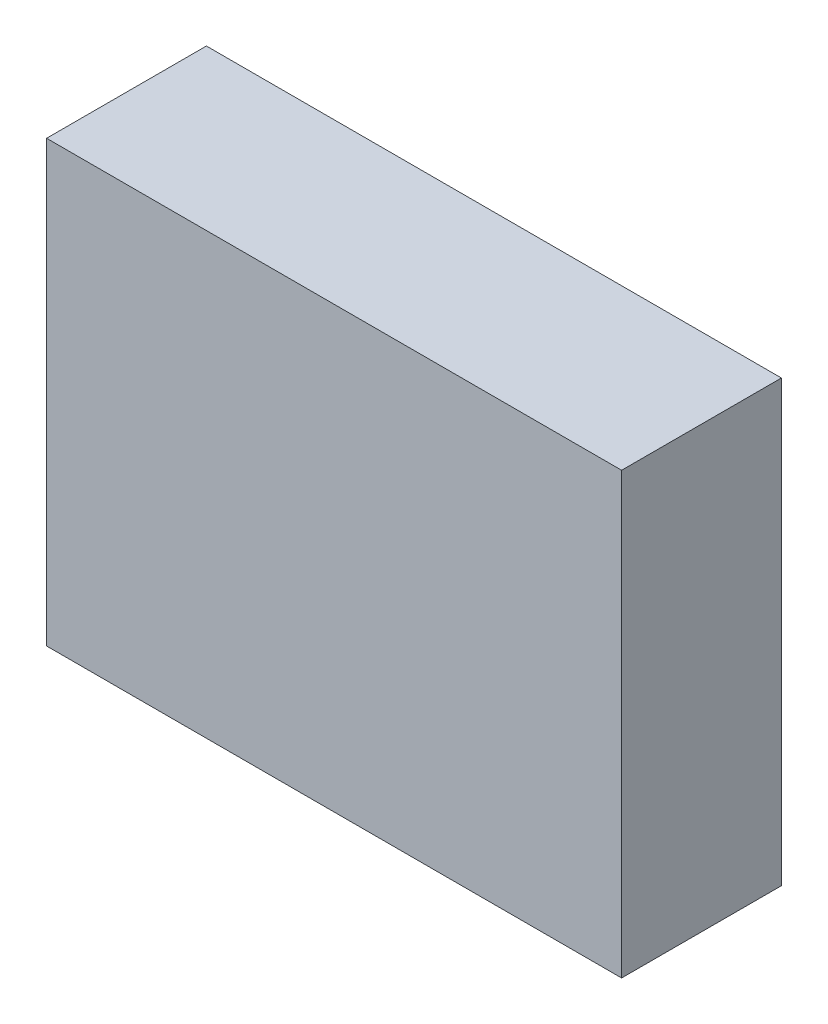
ISO-10303-21;
HEADER;
FILE_DESCRIPTION(('STEP AP214'),'2;1');
FILE_NAME('part.step','',(''),(''),'','','');
FILE_SCHEMA(('AUTOMOTIVE_DESIGN { 1 0 10303 214 1 1 1 1 }'));
ENDSEC;
DATA;
#1=APPLICATION_CONTEXT('core data for automotive mechanical design processes');
#2=APPLICATION_PROTOCOL_DEFINITION('international standard','automotive_design',2000,#1);
#3=PRODUCT_CONTEXT('',#1,'mechanical');
#4=PRODUCT('Part','Part','',(#3));
#5=PRODUCT_RELATED_PRODUCT_CATEGORY('part','',(#4));
#6=PRODUCT_DEFINITION_FORMATION('','',#4);
#7=PRODUCT_DEFINITION_CONTEXT('part definition',#1,'design');
#8=PRODUCT_DEFINITION('design','',#6,#7);
#9=PRODUCT_DEFINITION_SHAPE('','',#8);
#10=(LENGTH_UNIT() NAMED_UNIT(*) SI_UNIT(.MILLI.,.METRE.));
#11=(NAMED_UNIT(*) PLANE_ANGLE_UNIT() SI_UNIT($,.RADIAN.));
#12=(NAMED_UNIT(*) SI_UNIT($,.STERADIAN.) SOLID_ANGLE_UNIT());
#13=UNCERTAINTY_MEASURE_WITH_UNIT(LENGTH_MEASURE(1.E-05),#10,'distance_accuracy_value','');
#14=(GEOMETRIC_REPRESENTATION_CONTEXT(3) GLOBAL_UNCERTAINTY_ASSIGNED_CONTEXT((#13)) GLOBAL_UNIT_ASSIGNED_CONTEXT((#10,
#11,#12)) REPRESENTATION_CONTEXT('',''));
#15=CARTESIAN_POINT('',(0.,0.,0.));
#16=DIRECTION('',(0.,0.,1.));
#17=DIRECTION('',(1.,0.,0.));
#18=AXIS2_PLACEMENT_3D('',#15,#16,#17);
#19=CARTESIAN_POINT('',(-1.0795,0.8255,0.5999988));
#20=DIRECTION('',(0.,0.,1.));
#21=DIRECTION('',(1.,0.,0.));
#22=AXIS2_PLACEMENT_3D('',#19,#20,#21);
#23=PLANE('',#22);
#24=DIRECTION('',(0.,1.,0.));
#25=VECTOR('',#24,1.);
#26=CARTESIAN_POINT('',(1.0795,0.8255,0.5999988));
#27=LINE('',#26,#25);
#28=CARTESIAN_POINT('',(1.0795,0.8255,0.5999988));
#29=VERTEX_POINT('',#28);
#30=CARTESIAN_POINT('',(1.0795,-0.8255,0.5999988));
#31=VERTEX_POINT('',#30);
#32=EDGE_CURVE('E53',#29,#31,#27,.F.);
#33=ORIENTED_EDGE('',*,*,#32,.F.);
#34=DIRECTION('',(1.,0.,0.));
#35=VECTOR('',#34,1.);
#36=CARTESIAN_POINT('',(-1.0795,0.8255,0.5999988));
#37=LINE('',#36,#35);
#38=CARTESIAN_POINT('',(-1.0795,0.8255,0.5999988));
#39=VERTEX_POINT('',#38);
#40=EDGE_CURVE('E68',#39,#29,#37,.T.);
#41=ORIENTED_EDGE('',*,*,#40,.F.);
#42=DIRECTION('',(0.,1.,0.));
#43=VECTOR('',#42,1.);
#44=CARTESIAN_POINT('',(-1.0795,-0.8255,0.5999988));
#45=LINE('',#44,#43);
#46=CARTESIAN_POINT('',(-1.0795,-0.8255,0.5999988));
#47=VERTEX_POINT('',#46);
#48=EDGE_CURVE('E20',#47,#39,#45,.T.);
#49=ORIENTED_EDGE('',*,*,#48,.F.);
#50=DIRECTION('',(1.,0.,0.));
#51=VECTOR('',#50,1.);
#52=CARTESIAN_POINT('',(1.0795,-0.8255,0.5999988));
#53=LINE('',#52,#51);
#54=EDGE_CURVE('E58',#31,#47,#53,.F.);
#55=ORIENTED_EDGE('',*,*,#54,.F.);
#56=EDGE_LOOP('',(#33,#41,#49,#55));
#57=FACE_BOUND('',#56,.T.);
#58=ADVANCED_FACE('F17',(#57),#23,.T.);
#59=CARTESIAN_POINT('',(-1.0795,-0.8255,0.));
#60=DIRECTION('',(-1.,0.,0.));
#61=DIRECTION('',(0.,0.,1.));
#62=AXIS2_PLACEMENT_3D('',#59,#60,#61);
#63=PLANE('',#62);
#64=DIRECTION('',(0.,0.,1.));
#65=VECTOR('',#64,1.);
#66=CARTESIAN_POINT('',(-1.0795,0.8255,0.));
#67=LINE('',#66,#65);
#68=CARTESIAN_POINT('',(-1.0795,0.8255,0.));
#69=VERTEX_POINT('',#68);
#70=EDGE_CURVE('E79',#69,#39,#67,.T.);
#71=ORIENTED_EDGE('',*,*,#70,.F.);
#72=DIRECTION('',(0.,1.,0.));
#73=VECTOR('',#72,1.);
#74=CARTESIAN_POINT('',(-1.0795,0.8255,0.));
#75=LINE('',#74,#73);
#76=CARTESIAN_POINT('',(-1.0795,-0.8255,0.));
#77=VERTEX_POINT('',#76);
#78=EDGE_CURVE('E74',#69,#77,#75,.F.);
#79=ORIENTED_EDGE('',*,*,#78,.T.);
#80=DIRECTION('',(0.,0.,-1.));
#81=VECTOR('',#80,1.);
#82=CARTESIAN_POINT('',(-1.0795,-0.8255,0.));
#83=LINE('',#82,#81);
#84=EDGE_CURVE('E63',#47,#77,#83,.T.);
#85=ORIENTED_EDGE('',*,*,#84,.F.);
#86=ORIENTED_EDGE('',*,*,#48,.T.);
#87=EDGE_LOOP('',(#71,#79,#85,#86));
#88=FACE_BOUND('',#87,.T.);
#89=ADVANCED_FACE('F73',(#88),#63,.T.);
#90=CARTESIAN_POINT('',(1.0795,-0.8255,0.));
#91=DIRECTION('',(0.,-1.,0.));
#92=DIRECTION('',(0.,0.,-1.));
#93=AXIS2_PLACEMENT_3D('',#90,#91,#92);
#94=PLANE('',#93);
#95=ORIENTED_EDGE('',*,*,#84,.T.);
#96=DIRECTION('',(1.,0.,0.));
#97=VECTOR('',#96,1.);
#98=CARTESIAN_POINT('',(-1.0795,-0.8255,0.));
#99=LINE('',#98,#97);
#100=CARTESIAN_POINT('',(1.0795,-0.8255,0.));
#101=VERTEX_POINT('',#100);
#102=EDGE_CURVE('E84',#77,#101,#99,.T.);
#103=ORIENTED_EDGE('',*,*,#102,.T.);
#104=DIRECTION('',(0.,0.,-1.));
#105=VECTOR('',#104,1.);
#106=CARTESIAN_POINT('',(1.0795,-0.8255,0.));
#107=LINE('',#106,#105);
#108=EDGE_CURVE('E65',#31,#101,#107,.T.);
#109=ORIENTED_EDGE('',*,*,#108,.F.);
#110=ORIENTED_EDGE('',*,*,#54,.T.);
#111=EDGE_LOOP('',(#95,#103,#109,#110));
#112=FACE_BOUND('',#111,.T.);
#113=ADVANCED_FACE('F60',(#112),#94,.T.);
#114=CARTESIAN_POINT('',(1.0795,0.8255,0.));
#115=DIRECTION('',(1.,0.,0.));
#116=DIRECTION('',(0.,0.,-1.));
#117=AXIS2_PLACEMENT_3D('',#114,#115,#116);
#118=PLANE('',#117);
#119=ORIENTED_EDGE('',*,*,#108,.T.);
#120=DIRECTION('',(0.,1.,0.));
#121=VECTOR('',#120,1.);
#122=CARTESIAN_POINT('',(1.0795,0.8255,0.));
#123=LINE('',#122,#121);
#124=CARTESIAN_POINT('',(1.0795,0.8255,0.));
#125=VERTEX_POINT('',#124);
#126=EDGE_CURVE('E26',#101,#125,#123,.T.);
#127=ORIENTED_EDGE('',*,*,#126,.T.);
#128=DIRECTION('',(0.,0.,1.));
#129=VECTOR('',#128,1.);
#130=CARTESIAN_POINT('',(1.0795,0.8255,0.));
#131=LINE('',#130,#129);
#132=EDGE_CURVE('E34',#29,#125,#131,.F.);
#133=ORIENTED_EDGE('',*,*,#132,.F.);
#134=ORIENTED_EDGE('',*,*,#32,.T.);
#135=EDGE_LOOP('',(#119,#127,#133,#134));
#136=FACE_BOUND('',#135,.T.);
#137=ADVANCED_FACE('F88',(#136),#118,.T.);
#138=CARTESIAN_POINT('',(-1.0795,0.8255,0.));
#139=DIRECTION('',(0.,1.,0.));
#140=DIRECTION('',(0.,0.,1.));
#141=AXIS2_PLACEMENT_3D('',#138,#139,#140);
#142=PLANE('',#141);
#143=ORIENTED_EDGE('',*,*,#132,.T.);
#144=DIRECTION('',(1.,0.,0.));
#145=VECTOR('',#144,1.);
#146=CARTESIAN_POINT('',(-1.0795,0.8255,0.));
#147=LINE('',#146,#145);
#148=EDGE_CURVE('E11',#125,#69,#147,.F.);
#149=ORIENTED_EDGE('',*,*,#148,.T.);
#150=ORIENTED_EDGE('',*,*,#70,.T.);
#151=ORIENTED_EDGE('',*,*,#40,.T.);
#152=EDGE_LOOP('',(#143,#149,#150,#151));
#153=FACE_BOUND('',#152,.T.);
#154=ADVANCED_FACE('F91',(#153),#142,.T.);
#155=CARTESIAN_POINT('',(-1.0795,0.8255,0.));
#156=DIRECTION('',(0.,0.,1.));
#157=DIRECTION('',(1.,0.,0.));
#158=AXIS2_PLACEMENT_3D('',#155,#156,#157);
#159=PLANE('',#158);
#160=ORIENTED_EDGE('',*,*,#126,.F.);
#161=ORIENTED_EDGE('',*,*,#102,.F.);
#162=ORIENTED_EDGE('',*,*,#78,.F.);
#163=ORIENTED_EDGE('',*,*,#148,.F.);
#164=EDGE_LOOP('',(#160,#161,#162,#163));
#165=FACE_BOUND('',#164,.T.);
#166=ADVANCED_FACE('F90',(#165),#159,.F.);
#167=CLOSED_SHELL('',(#58,#89,#113,#137,#154,#166));
#168=MANIFOLD_SOLID_BREP('B1',#167);
#169=ADVANCED_BREP_SHAPE_REPRESENTATION('',(#18,#168),#14);
#170=SHAPE_DEFINITION_REPRESENTATION(#9,#169);
ENDSEC;
END-ISO-10303-21;
